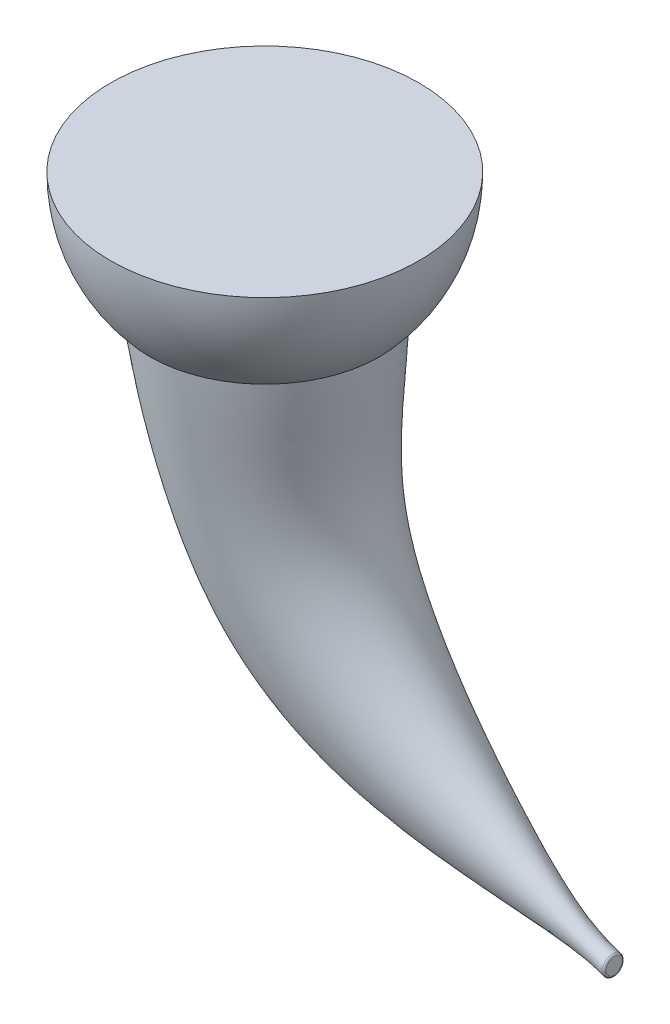
ISO-10303-21;
HEADER;
FILE_DESCRIPTION(('STEP AP214'),'2;1');
FILE_NAME('part.step','',(''),(''),'','','');
FILE_SCHEMA(('AUTOMOTIVE_DESIGN { 1 0 10303 214 1 1 1 1 }'));
ENDSEC;
DATA;
#1=APPLICATION_CONTEXT('core data for automotive mechanical design processes');
#2=APPLICATION_PROTOCOL_DEFINITION('international standard','automotive_design',2000,#1);
#3=PRODUCT_CONTEXT('',#1,'mechanical');
#4=PRODUCT('Part','Part','',(#3));
#5=PRODUCT_RELATED_PRODUCT_CATEGORY('part','',(#4));
#6=PRODUCT_DEFINITION_FORMATION('','',#4);
#7=PRODUCT_DEFINITION_CONTEXT('part definition',#1,'design');
#8=PRODUCT_DEFINITION('design','',#6,#7);
#9=PRODUCT_DEFINITION_SHAPE('','',#8);
#10=(LENGTH_UNIT() NAMED_UNIT(*) SI_UNIT(.MILLI.,.METRE.));
#11=(NAMED_UNIT(*) PLANE_ANGLE_UNIT() SI_UNIT($,.RADIAN.));
#12=(NAMED_UNIT(*) SI_UNIT($,.STERADIAN.) SOLID_ANGLE_UNIT());
#13=UNCERTAINTY_MEASURE_WITH_UNIT(LENGTH_MEASURE(1.E-05),#10,'distance_accuracy_value','');
#14=(GEOMETRIC_REPRESENTATION_CONTEXT(3) GLOBAL_UNCERTAINTY_ASSIGNED_CONTEXT((#13)) GLOBAL_UNIT_ASSIGNED_CONTEXT((#10,
#11,#12)) REPRESENTATION_CONTEXT('',''));
#15=CARTESIAN_POINT('',(0.,0.,0.));
#16=DIRECTION('',(0.,0.,1.));
#17=DIRECTION('',(1.,0.,0.));
#18=AXIS2_PLACEMENT_3D('',#15,#16,#17);
#19=CARTESIAN_POINT('',(17.,-25.,0.));
#20=DIRECTION('',(-1.,0.,0.));
#21=DIRECTION('',(0.,0.,1.));
#22=AXIS2_PLACEMENT_3D('',#19,#20,#21);
#23=PLANE('',#22);
#24=CARTESIAN_POINT('',(17.,-25.3356408166107,0.122282258978879));
#25=CARTESIAN_POINT('',(17.,-25.4697729904689,0.167322496235213));
#26=CARTESIAN_POINT('',(16.8666221119389,-25.4250025036247,0.152289016261358));
#27=CARTESIAN_POINT('',(17.,-25.3321107105864,0.13279880806398));
#28=CARTESIAN_POINT('',(17.,-25.4647024969682,0.181508120353089));
#29=CARTESIAN_POINT('',(16.8668049699655,-25.4206870517036,0.165345043521263));
#30=CARTESIAN_POINT('',(17.,-25.3281366736652,0.143159465604385));
#31=CARTESIAN_POINT('',(17.,-25.4589900298676,0.19545455038704));
#32=CARTESIAN_POINT('',(16.8670174684006,-25.4158286119792,0.178213354682603));
#33=CARTESIAN_POINT('',(17.,-25.3193446290216,0.163516505921891));
#34=CARTESIAN_POINT('',(17.,-25.4464836853122,0.222635002906174));
#35=CARTESIAN_POINT('',(16.8674674932555,-25.4051191167752,0.203410457307485));
#36=CARTESIAN_POINT('',(17.,-25.3145266057802,0.173512881996638));
#37=CARTESIAN_POINT('',(17.,-25.4396956099888,0.235866574435541));
#38=CARTESIAN_POINT('',(16.8677050201355,-25.3992680430436,0.215739238845151));
#39=CARTESIAN_POINT('',(17.,-25.2988706797844,0.202858771474465));
#40=CARTESIAN_POINT('',(17.,-25.4175854368461,0.274579648905682));
#41=CARTESIAN_POINT('',(16.868533222332,-25.3802128542943,0.252046994042914));
#42=CARTESIAN_POINT('',(17.,-25.2868252910844,0.221581620130043));
#43=CARTESIAN_POINT('',(17.,-25.4004996861291,0.299188251594623));
#44=CARTESIAN_POINT('',(16.8692397088052,-25.3655000011405,0.275367640427366));
#45=CARTESIAN_POINT('',(17.,-25.2595335942021,0.257059365041849));
#46=CARTESIAN_POINT('',(17.,-25.3618327407779,0.345277999124935));
#47=CARTESIAN_POINT('',(16.8709463143362,-25.3320762598217,0.319701931761529));
#48=CARTESIAN_POINT('',(17.,-25.2442347712504,0.273773911076594));
#49=CARTESIAN_POINT('',(17.,-25.3402998487906,0.366656908153542));
#50=CARTESIAN_POINT('',(16.8719513737534,-25.313299676778,0.340667851281826));
#51=CARTESIAN_POINT('',(17.,-25.2110508457208,0.304347443948018));
#52=CARTESIAN_POINT('',(17.,-25.2938747267772,0.405011108570092));
#53=CARTESIAN_POINT('',(16.8742367584853,-25.2724779062474,0.379143763399635));
#54=CARTESIAN_POINT('',(17.,-25.1931660868497,0.318206809685112));
#55=CARTESIAN_POINT('',(17.,-25.2691123868465,0.421990423691124));
#56=CARTESIAN_POINT('',(16.8755170472291,-25.2504331531358,0.396654214546572));
#57=CARTESIAN_POINT('',(17.,-25.1367874613879,0.354589595850642));
#58=CARTESIAN_POINT('',(17.,-25.1924367570646,0.464899114605402));
#59=CARTESIAN_POINT('',(16.8796962835128,-25.1808059570031,0.442772001750696));
#60=CARTESIAN_POINT('',(17.,-25.0951095931608,0.37250397611175));
#61=CARTESIAN_POINT('',(17.,-25.1367931879768,0.484596402633514));
#62=CARTESIAN_POINT('',(16.8829619917275,-25.1291682571869,0.465701752987218));
#63=CARTESIAN_POINT('',(17.,-25.0300334068381,0.388357309817668));
#64=CARTESIAN_POINT('',(17.,-25.0505506496973,0.498824042553357));
#65=CARTESIAN_POINT('',(16.8885460133124,-25.0480532206865,0.486232112619357));
#66=CARTESIAN_POINT('',(17.,-25.0077918815382,0.391793949074053));
#67=CARTESIAN_POINT('',(17.,-25.0217374913723,0.501057576620627));
#68=CARTESIAN_POINT('',(16.8905337982318,-25.0202502738573,0.490751486980942));
#69=CARTESIAN_POINT('',(17.,-24.9630242074133,0.394830716283366));
#70=CARTESIAN_POINT('',(17.,-24.964351313639,0.500402262707482));
#71=CARTESIAN_POINT('',(16.8947268457448,-24.9641114737629,0.494868823599477));
#72=CARTESIAN_POINT('',(17.,-24.9404981709376,0.394432314079834));
#73=CARTESIAN_POINT('',(17.,-24.935817714864,0.49762911897101));
#74=CARTESIAN_POINT('',(16.8969320246979,-24.9357758288185,0.494468671330683));
#75=CARTESIAN_POINT('',(17.,-24.8962471892877,0.38975547168622));
#76=CARTESIAN_POINT('',(17.,-24.8804567384404,0.487233053040091));
#77=CARTESIAN_POINT('',(16.9014114728652,-24.8800482469581,0.488614987584741));
#78=CARTESIAN_POINT('',(17.,-24.8745151229341,0.385545288041291));
#79=CARTESIAN_POINT('',(17.,-24.8536007603101,0.479804947204921));
#80=CARTESIAN_POINT('',(16.903683848871,-24.8526484759303,0.483250317133353));
#81=CARTESIAN_POINT('',(17.,-24.8427166582274,0.376492739656416));
#82=CARTESIAN_POINT('',(17.,-24.8146665928344,0.4654022128681));
#83=CARTESIAN_POINT('',(16.9070388378222,-24.8126452040515,0.471653210960662));
#84=CARTESIAN_POINT('',(17.,-24.8322447796421,0.373016285337634));
#85=CARTESIAN_POINT('',(17.,-24.8019945240739,0.460106278827564));
#86=CARTESIAN_POINT('',(16.9081488473374,-24.7994864208703,0.467192316883826));
#87=CARTESIAN_POINT('',(17.,-24.8116319603346,0.365191275706193));
#88=CARTESIAN_POINT('',(17.,-24.7772737238806,0.448609115009445));
#89=CARTESIAN_POINT('',(16.9103002164359,-24.7736890196705,0.457189781614473));
#90=CARTESIAN_POINT('',(17.,-24.8014910558755,0.36084262520218));
#91=CARTESIAN_POINT('',(17.,-24.765209497933,0.442412210742255));
#92=CARTESIAN_POINT('',(16.9113415685094,-24.7610504586106,0.451648022458333));
#93=CARTESIAN_POINT('',(17.,-24.7719303022118,0.346645892745383));
#94=CARTESIAN_POINT('',(17.,-24.7303074587816,0.422577140854096));
#95=CARTESIAN_POINT('',(16.914439101884,-24.7241357450048,0.433483518898954));
#96=CARTESIAN_POINT('',(17.,-24.7530809069025,0.335563341447202));
#97=CARTESIAN_POINT('',(17.,-24.708059222266,0.407436594534156));
#98=CARTESIAN_POINT('',(16.9164970100325,-24.7004992512258,0.419216874938152));
#99=CARTESIAN_POINT('',(17.,-24.7176110893768,0.310329682907767));
#100=CARTESIAN_POINT('',(17.,-24.6666396821066,0.374026502344487));
#101=CARTESIAN_POINT('',(16.9202407122356,-24.6561790676793,0.38683613208621));
#102=CARTESIAN_POINT('',(17.,-24.7009894377288,0.296180279558163));
#103=CARTESIAN_POINT('',(17.,-24.647347231466,0.355749695696653));
#104=CARTESIAN_POINT('',(16.9219267118711,-24.6354937488282,0.368724169703593));
#105=CARTESIAN_POINT('',(17.,-24.6557712124933,0.250400587069459));
#106=CARTESIAN_POINT('',(17.,-24.5956659274118,0.29828608994971));
#107=CARTESIAN_POINT('',(16.9262760985114,-24.5794937607475,0.310548159493342));
#108=CARTESIAN_POINT('',(17.,-24.6308846954614,0.214974266022337));
#109=CARTESIAN_POINT('',(17.,-24.5672112153915,0.254912811397691));
#110=CARTESIAN_POINT('',(16.9283367202792,-24.5490569111965,0.266029961272501));
#111=CARTESIAN_POINT('',(17.,-24.5931076458735,0.137091255155098));
#112=CARTESIAN_POINT('',(17.,-24.5244933692924,0.161671714754807));
#113=CARTESIAN_POINT('',(16.9311551015198,-24.5029965441759,0.169089188014232));
#114=CARTESIAN_POINT('',(17.,-24.5805535884695,0.0944727113789788));
#115=CARTESIAN_POINT('',(17.,-24.5102221269509,0.111199389269075));
#116=CARTESIAN_POINT('',(16.9318767708865,-24.4877883175131,0.116487950102534));
#117=CARTESIAN_POINT('',(17.,-24.5722343552345,0.0285955482823736));
#118=CARTESIAN_POINT('',(17.,-24.5006827170371,0.0335671276270605));
#119=CARTESIAN_POINT('',(16.9322042088683,-24.4776435968825,0.0351604764341383));
#120=CARTESIAN_POINT('',(17.,-24.5713001153891,0.00587650779675672));
#121=CARTESIAN_POINT('',(17.,-24.4995617278362,0.00679764329900963));
#122=CARTESIAN_POINT('',(16.9321795924319,-24.4764772274513,0.00710965890458925));
#123=CARTESIAN_POINT('',(17.,-24.5732716377448,-0.0393992992874983));
#124=CARTESIAN_POINT('',(17.,-24.5016317464374,-0.0465709644748686));
#125=CARTESIAN_POINT('',(16.9318626845769,-24.4788032515095,-0.048842198983232));
#126=CARTESIAN_POINT('',(17.,-24.5761730790444,-0.0619562197507527));
#127=CARTESIAN_POINT('',(17.,-24.50482517415,-0.0732242649487849));
#128=CARTESIAN_POINT('',(16.931570694469,-24.4822904028414,-0.0767433723859995));
#129=CARTESIAN_POINT('',(17.,-24.5840989781865,-0.0986627945584033));
#130=CARTESIAN_POINT('',(17.,-24.5136280731717,-0.116659255049918));
#131=CARTESIAN_POINT('',(16.9308667800196,-24.4918725381808,-0.122197502978594));
#132=CARTESIAN_POINT('',(17.,-24.5880599506323,-0.113052716446738));
#133=CARTESIAN_POINT('',(17.,-24.518051695873,-0.133737542722164));
#134=CARTESIAN_POINT('',(16.9305298737476,-24.4966701431352,-0.140030260627986));
#135=CARTESIAN_POINT('',(17.,-24.5975396907884,-0.141312065070061));
#136=CARTESIAN_POINT('',(17.,-24.5286406292673,-0.167291632582864));
#137=CARTESIAN_POINT('',(16.9297490021491,-24.5081356261946,-0.174997797370048));
#138=CARTESIAN_POINT('',(17.,-24.6030587802432,-0.155181383631858));
#139=CARTESIAN_POINT('',(17.,-24.5348159770334,-0.183779542681219));
#140=CARTESIAN_POINT('',(16.9293050147135,-24.5148038905808,-0.192132431466115));
#141=CARTESIAN_POINT('',(17.,-24.6185738770665,-0.188690900168415));
#142=CARTESIAN_POINT('',(17.,-24.5522684006844,-0.223887205283506));
#143=CARTESIAN_POINT('',(16.9280515487512,-24.5336379234617,-0.233700821015042));
#144=CARTESIAN_POINT('',(17.,-24.6294502826954,-0.207934421531435));
#145=CARTESIAN_POINT('',(17.,-24.5645884217861,-0.24714592586387));
#146=CARTESIAN_POINT('',(16.9271687022988,-24.5469095022974,-0.257725254138611));
#147=CARTESIAN_POINT('',(17.,-24.6542717196406,-0.244316968150462));
#148=CARTESIAN_POINT('',(17.,-24.592823555195,-0.291598409273236));
#149=CARTESIAN_POINT('',(16.9250660233958,-24.5773651977954,-0.303375074475826));
#150=CARTESIAN_POINT('',(17.,-24.668218348621,-0.261454890446322));
#151=CARTESIAN_POINT('',(17.,-24.6088101654415,-0.31283564894115));
#152=CARTESIAN_POINT('',(16.9238460154104,-24.5945513516625,-0.324999203788676));
#153=CARTESIAN_POINT('',(17.,-24.7141466767414,-0.308893459958356));
#154=CARTESIAN_POINT('',(17.,-24.6619779565283,-0.372724777110787));
#155=CARTESIAN_POINT('',(16.9197298815172,-24.6513389293173,-0.385015924591131));
#156=CARTESIAN_POINT('',(17.,-24.7502783971983,-0.335351300729194));
#157=CARTESIAN_POINT('',(17.,-24.7043800958971,-0.407180842360841));
#158=CARTESIAN_POINT('',(16.9163728794422,-24.6962441492336,-0.418718886741355));
#159=CARTESIAN_POINT('',(17.,-24.8289815373202,-0.374598436477156));
#160=CARTESIAN_POINT('',(17.,-24.7978225438548,-0.461146836178574));
#161=CARTESIAN_POINT('',(16.9090404968911,-24.794453369255,-0.468743826037898));
#162=CARTESIAN_POINT('',(17.,-24.871505987163,-0.387482347388135));
#163=CARTESIAN_POINT('',(17.,-24.8494613533892,-0.480479723271562));
#164=CARTESIAN_POINT('',(16.9050696211939,-24.8476962196587,-0.485186114328076));
#165=CARTESIAN_POINT('',(17.,-24.936744531951,-0.395903883081402));
#166=CARTESIAN_POINT('',(17.,-24.9296678219946,-0.496662193562039));
#167=CARTESIAN_POINT('',(16.8991686091905,-24.9295561631734,-0.495822150488316));
#168=CARTESIAN_POINT('',(17.,-24.9588779272943,-0.396864250744802));
#169=CARTESIAN_POINT('',(17.,-24.9574778115752,-0.499851027502412));
#170=CARTESIAN_POINT('',(16.8971984956658,-24.9573584158455,-0.496991326730204));
#171=CARTESIAN_POINT('',(17.,-25.0030120702838,-0.39503742373095));
#172=CARTESIAN_POINT('',(17.,-25.013626458617,-0.501557837277415));
#173=CARTESIAN_POINT('',(16.8933664230364,-25.0127732210582,-0.494517598669394));
#174=CARTESIAN_POINT('',(17.,-25.0250128023286,-0.392249796598471));
#175=CARTESIAN_POINT('',(17.,-25.041960776247,-0.499978941534042));
#176=CARTESIAN_POINT('',(16.8915044764382,-25.0403857513385,-0.490874139070745));
#177=CARTESIAN_POINT('',(17.,-25.0681055115317,-0.383019028402749));
#178=CARTESIAN_POINT('',(17.,-25.0981009724478,-0.491997250762882));
#179=CARTESIAN_POINT('',(16.8879718528896,-25.094362920631,-0.478934396295298));
#180=CARTESIAN_POINT('',(17.,-25.0892019156309,-0.376596600913957));
#181=CARTESIAN_POINT('',(17.,-25.125864452833,-0.485530814768234));
#182=CARTESIAN_POINT('',(16.8863001560458,-25.120733721388,-0.470664480874051));
#183=CARTESIAN_POINT('',(17.,-25.1198243034484,-0.364446530485284));
#184=CARTESIAN_POINT('',(17.,-25.1662228995006,-0.472489705694745));
#185=CARTESIAN_POINT('',(16.8839803323524,-25.1587632692938,-0.45519633363435));
#186=CARTESIAN_POINT('',(17.,-25.1298658237301,-0.359974438747207));
#187=CARTESIAN_POINT('',(17.,-25.1795412992087,-0.467541110438537));
#188=CARTESIAN_POINT('',(16.8832380435375,-25.1711907615819,-0.449526391682238));
#189=CARTESIAN_POINT('',(17.,-25.1495471292446,-0.350220128080431));
#190=CARTESIAN_POINT('',(17.,-25.2059185806254,-0.456469023524208));
#191=CARTESIAN_POINT('',(16.8817797099444,-25.195624146631,-0.437125367287789));
#192=CARTESIAN_POINT('',(17.,-25.1591869202806,-0.344937920859544));
#193=CARTESIAN_POINT('',(17.,-25.2189724634216,-0.450336202042438));
#194=CARTESIAN_POINT('',(16.8810636647871,-25.2076300454817,-0.430394300180825));
#195=CARTESIAN_POINT('',(17.,-25.1876470890645,-0.327722235721094));
#196=CARTESIAN_POINT('',(17.,-25.257949279396,-0.429910496900015));
#197=CARTESIAN_POINT('',(16.8789507511417,-25.2430672833188,-0.408465927819508));
#198=CARTESIAN_POINT('',(17.,-25.2057300429862,-0.314528614547533));
#199=CARTESIAN_POINT('',(17.,-25.2829174808517,-0.413840201488044));
#200=CARTESIAN_POINT('',(16.8776098005377,-25.2655714250674,-0.391672500396162));
#201=CARTESIAN_POINT('',(17.,-25.239306087731,-0.285231940402884));
#202=CARTESIAN_POINT('',(17.,-25.3298349011895,-0.377339668378698));
#203=CARTESIAN_POINT('',(16.875126098613,-25.3072548539831,-0.354497694776287));
#204=CARTESIAN_POINT('',(17.,-25.2548000470401,-0.269129866868184));
#205=CARTESIAN_POINT('',(17.,-25.3516833981736,-0.356879287319027));
#206=CARTESIAN_POINT('',(16.8739832808233,-25.3264352561891,-0.33411752449308));
#207=CARTESIAN_POINT('',(17.,-25.2958984093582,-0.218205912932596));
#208=CARTESIAN_POINT('',(17.,-25.4105853869264,-0.290868574819163));
#209=CARTESIAN_POINT('',(16.8709409022239,-25.3771065775477,-0.269981742926947));
#210=CARTESIAN_POINT('',(17.,-25.3174164810731,-0.17995446094423));
#211=CARTESIAN_POINT('',(17.,-25.4414189536892,-0.240631265944746));
#212=CARTESIAN_POINT('',(16.8693324560289,-25.4033468493564,-0.222182566693656));
#213=CARTESIAN_POINT('',(17.,-25.3472657982975,-0.0978093254314152));
#214=CARTESIAN_POINT('',(17.,-25.4852407606026,-0.130903484732841));
#215=CARTESIAN_POINT('',(16.8669477005696,-25.439585802428,-0.120130880840412));
#216=CARTESIAN_POINT('',(17.,-25.3553411910705,-0.0538229869313334));
#217=CARTESIAN_POINT('',(17.,-25.4972596109713,-0.0718250108398934));
#218=CARTESIAN_POINT('',(16.8661876253379,-25.4492694549901,-0.0657738312602855));
#219=CARTESIAN_POINT('',(17.,-25.3564575246691,0.0125405539565123));
#220=CARTESIAN_POINT('',(17.,-25.4994128896306,0.0182621429726876));
#221=CARTESIAN_POINT('',(16.865778483532,-25.4504934650714,0.0162928174581873));
#222=CARTESIAN_POINT('',(17.,-25.3549263529602,0.0349453914634985));
#223=CARTESIAN_POINT('',(17.,-25.4973570392948,0.0487139920407503));
#224=CARTESIAN_POINT('',(16.8657675215188,-25.4485988801544,0.044008884352947));
#225=CARTESIAN_POINT('',(17.,-25.3480797122561,0.0792058405355065));
#226=CARTESIAN_POINT('',(17.,-25.4876596994949,0.108930955179652));
#227=CARTESIAN_POINT('',(16.8660048388089,-25.4402074897351,0.0988344367549028));
#228=CARTESIAN_POINT('',(17.,-25.3427640467222,0.101061423515279));
#229=CARTESIAN_POINT('',(17.,-25.4800469779742,0.138579154995805));
#230=CARTESIAN_POINT('',(16.8662531315762,-25.4337104452153,0.125943890683688));
#231=CARTESIAN_POINT('',(17.,-25.3356408166107,0.122282258978879));
#232=CARTESIAN_POINT('',(17.,-25.4697729904689,0.167322496235213));
#233=CARTESIAN_POINT('',(16.8666221119389,-25.4250025036247,0.152289016261358));
#234=(BOUNDED_SURFACE() B_SPLINE_SURFACE(3,2,((#24,#25,#26),(#27,#28,#29),(#30,#31,#32),(#33,
#34,#35),(#36,#37,#38),(#39,#40,#41),(#42,#43,#44),(#45,#46,#47),(#48,#49,#50),(#51,#52,#53),
(#54,#55,#56),(#57,#58,#59),(#60,#61,#62),(#63,#64,#65),(#66,#67,#68),(#69,#70,#71),(#72,#73,
#74),(#75,#76,#77),(#78,#79,#80),(#81,#82,#83),(#84,#85,#86),(#87,#88,#89),(#90,#91,#92),(#93,
#94,#95),(#96,#97,#98),(#99,#100,#101),(#102,#103,#104),(#105,#106,#107),(#108,#109,#110),(#111,
#112,#113),(#114,#115,#116),(#117,#118,#119),(#120,#121,#122),(#123,#124,#125),(#126,#127,#128),
(#129,#130,#131),(#132,#133,#134),(#135,#136,#137),(#138,#139,#140),(#141,#142,#143),(#144,#145,
#146),(#147,#148,#149),(#150,#151,#152),(#153,#154,#155),(#156,#157,#158),(#159,#160,#161),
(#162,#163,#164),(#165,#166,#167),(#168,#169,#170),(#171,#172,#173),(#174,#175,#176),(#177,#178,
#179),(#180,#181,#182),(#183,#184,#185),(#186,#187,#188),(#189,#190,#191),(#192,#193,#194),
(#195,#196,#197),(#198,#199,#200),(#201,#202,#203),(#204,#205,#206),(#207,#208,#209),(#210,#211,
#212),(#213,#214,#215),(#216,#217,#218),(#219,#220,#221),(#222,#223,#224),(#225,#226,#227),
(#228,#229,#230),(#231,#232,#233)),.UNSPECIFIED.,.T.,.F.,.F.) B_SPLINE_SURFACE_WITH_KNOTS((4,2,
2,2,2,2,2,2,2,2,2,2,2,2,2,2,2,2,2,2,2,2,2,2,2,2,2,2,2,2,2,2,2,2,4),(3,3),(0.,0.0332575604123347,
0.0665157324162518,0.13298019202367,0.200612266715542,0.268235360415139,0.401352162305116,
0.468616423498455,0.535854905569663,0.601912675935396,0.634978766946504,0.668048468751283,
0.733289229014274,0.798493835090958,0.925925104128339,1.05674387565176,1.12469064654031,
1.19256094046045,1.23725183199459,1.28195195876207,1.34793632299314,1.41395510527295,
1.54557656675133,1.67627437622517,1.74246922205142,1.80867170629913,1.87450066843399,
1.90744577642885,1.94039040834494,2.00716458288537,2.07391631265868,2.20306105121793,
2.33463680242306,2.4017421389119,2.46885096060995),(0.,1.),
.UNSPECIFIED.) GEOMETRIC_REPRESENTATION_ITEM() RATIONAL_B_SPLINE_SURFACE(((1.,0.577157309314127,
1.),(1.,0.577949224529891,1.),(1.,0.578867965708101,1.),(1.,0.580808548052177,1.),(1.,
0.581830391113694,1.),(1.,0.585381509929811,1.),(1.,0.588397209411046,1.),(1.,0.595604579601681,
1.),(1.,0.599815978500449,1.),(1.,0.609266864984566,1.),(1.,0.614506215973792,1.),(1.,
0.631351979661977,1.),(1.,0.644210379512988,1.),(1.,0.665418271155843,1.),(1.,0.672851529180123,
1.),(1.,0.688253331010856,1.),(1.,0.696221668576475,1.),(1.,0.712123104809014,1.),(1.,
0.720054365191013,1.),(1.,0.731579759901674,1.),(1.,0.735361663975748,1.),(1.,0.742640581586167,
1.),(1.,0.74613756396757,1.),(1.,0.756465342357467,1.),(1.,0.763229849057768,1.),(1.,
0.775398507694245,1.),(1.,0.780803411414885,1.),(1.,0.794649246945422,1.),(1.,0.801065063798609,
1.),(1.,0.809809875739834,1.),(1.,0.812025697172242,1.),(1.,0.813031619676622,1.),(1.,
0.812956324528348,1.),(1.,0.811981449518719,1.),(1.,0.811082797520106,1.),(1.,0.808909493710978,
1.),(1.,0.80786807340303,1.),(1.,0.805448001940625,1.),(1.,0.804069281142938,1.),(1.,
0.80016459911248,1.),(1.,0.797404962311162,1.),(1.,0.790784968629018,1.),(1.,0.786924038353347,
1.),(1.,0.773773844974525,1.),(1.,0.762902877052981,1.),(1.,0.73847444302014,1.),(1.,
0.724936364719492,1.),(1.,0.704197512137542,1.),(1.,0.697166565590311,1.),(1.,0.683285964157835,
1.),(1.,0.676436330285997,1.),(1.,0.663251429938828,1.),(1.,0.6569134793905,1.),(1.,
0.648005281227929,1.),(1.,0.645134475347812,1.),(1.,0.639457885996645,1.),(1.,0.636652101586579,
1.),(1.,0.628319107731566,1.),(1.,0.622955912835725,1.),(1.,0.612907749284322,1.),(1.,
0.608222553262889,1.),(1.,0.595628845647884,1.),(1.,0.58880080235283,1.),(1.,0.578590147848599,
1.),(1.,0.575274812695336,1.),(1.,0.573491038076502,1.),(1.,0.57344365238074,1.),(1.,
0.574477774989074,1.),(1.,0.575559341923983,1.),(1.,0.577157309314127,1.))) REPRESENTATION_ITEM('') SURFACE());
#235=CARTESIAN_POINT('',(17.,-25.3356408166107,0.122282258978879));
#236=CARTESIAN_POINT('',(17.,-25.3321107105864,0.13279880806398));
#237=CARTESIAN_POINT('',(17.,-25.3281366736652,0.143159465604385));
#238=CARTESIAN_POINT('',(17.,-25.3193446290216,0.163516505921891));
#239=CARTESIAN_POINT('',(17.,-25.3145266057802,0.173512881996638));
#240=CARTESIAN_POINT('',(17.,-25.2988706797844,0.202858771474465));
#241=CARTESIAN_POINT('',(17.,-25.2868252910844,0.221581620130043));
#242=CARTESIAN_POINT('',(17.,-25.2595335942021,0.257059365041849));
#243=CARTESIAN_POINT('',(17.,-25.2442347712504,0.273773911076594));
#244=CARTESIAN_POINT('',(17.,-25.2110508457208,0.304347443948018));
#245=CARTESIAN_POINT('',(17.,-25.1931660868497,0.318206809685112));
#246=CARTESIAN_POINT('',(17.,-25.1367874613879,0.354589595850642));
#247=CARTESIAN_POINT('',(17.,-25.0951095931608,0.37250397611175));
#248=CARTESIAN_POINT('',(17.,-25.0300334068381,0.388357309817668));
#249=CARTESIAN_POINT('',(17.,-25.0077918815382,0.391793949074053));
#250=CARTESIAN_POINT('',(17.,-24.9630242074133,0.394830716283366));
#251=CARTESIAN_POINT('',(17.,-24.9404981709376,0.394432314079834));
#252=CARTESIAN_POINT('',(17.,-24.8962471892877,0.38975547168622));
#253=CARTESIAN_POINT('',(17.,-24.8745151229342,0.385545288041291));
#254=CARTESIAN_POINT('',(17.,-24.8427166582274,0.376492739656416));
#255=CARTESIAN_POINT('',(17.,-24.8322447796421,0.373016285337634));
#256=CARTESIAN_POINT('',(17.,-24.8116319603346,0.365191275706193));
#257=CARTESIAN_POINT('',(17.,-24.8014910558755,0.36084262520218));
#258=CARTESIAN_POINT('',(17.,-24.7719303022118,0.346645892745383));
#259=CARTESIAN_POINT('',(17.,-24.7530809069025,0.335563341447202));
#260=CARTESIAN_POINT('',(17.,-24.7176110893768,0.310329682907767));
#261=CARTESIAN_POINT('',(17.,-24.7009894377288,0.296180279558163));
#262=CARTESIAN_POINT('',(17.,-24.6557712124933,0.250400587069459));
#263=CARTESIAN_POINT('',(17.,-24.6308846954614,0.214974266022337));
#264=CARTESIAN_POINT('',(17.,-24.5931076458735,0.137091255155098));
#265=CARTESIAN_POINT('',(17.,-24.5805535884695,0.0944727113789787));
#266=CARTESIAN_POINT('',(17.,-24.5722343552345,0.0285955482823737));
#267=CARTESIAN_POINT('',(17.,-24.5713001153891,0.00587650779675672));
#268=CARTESIAN_POINT('',(17.,-24.5732716377448,-0.0393992992874982));
#269=CARTESIAN_POINT('',(17.,-24.5761730790444,-0.0619562197507527));
#270=CARTESIAN_POINT('',(17.,-24.5840989781865,-0.0986627945584033));
#271=CARTESIAN_POINT('',(17.,-24.5880599506323,-0.113052716446738));
#272=CARTESIAN_POINT('',(17.,-24.5975396907884,-0.141312065070061));
#273=CARTESIAN_POINT('',(17.,-24.6030587802432,-0.155181383631858));
#274=CARTESIAN_POINT('',(17.,-24.6185738770665,-0.188690900168415));
#275=CARTESIAN_POINT('',(17.,-24.6294502826954,-0.207934421531435));
#276=CARTESIAN_POINT('',(17.,-24.6542717196406,-0.244316968150462));
#277=CARTESIAN_POINT('',(17.,-24.668218348621,-0.261454890446321));
#278=CARTESIAN_POINT('',(17.,-24.7141466767414,-0.308893459958356));
#279=CARTESIAN_POINT('',(17.,-24.7502783971983,-0.335351300729194));
#280=CARTESIAN_POINT('',(17.,-24.8289815373202,-0.374598436477156));
#281=CARTESIAN_POINT('',(17.,-24.871505987163,-0.387482347388135));
#282=CARTESIAN_POINT('',(17.,-24.936744531951,-0.395903883081402));
#283=CARTESIAN_POINT('',(17.,-24.9588779272943,-0.396864250744802));
#284=CARTESIAN_POINT('',(17.,-25.0030120702838,-0.39503742373095));
#285=CARTESIAN_POINT('',(17.,-25.0250128023286,-0.392249796598471));
#286=CARTESIAN_POINT('',(17.,-25.0681055115317,-0.383019028402749));
#287=CARTESIAN_POINT('',(17.,-25.0892019156309,-0.376596600913957));
#288=CARTESIAN_POINT('',(17.,-25.1198243034484,-0.364446530485284));
#289=CARTESIAN_POINT('',(17.,-25.1298658237301,-0.359974438747207));
#290=CARTESIAN_POINT('',(17.,-25.1495471292446,-0.350220128080431));
#291=CARTESIAN_POINT('',(17.,-25.1591869202806,-0.344937920859544));
#292=CARTESIAN_POINT('',(17.,-25.1876470890645,-0.327722235721094));
#293=CARTESIAN_POINT('',(17.,-25.2057300429862,-0.314528614547533));
#294=CARTESIAN_POINT('',(17.,-25.239306087731,-0.285231940402884));
#295=CARTESIAN_POINT('',(17.,-25.2548000470401,-0.269129866868184));
#296=CARTESIAN_POINT('',(17.,-25.2958984093582,-0.218205912932596));
#297=CARTESIAN_POINT('',(17.,-25.3174164810731,-0.17995446094423));
#298=CARTESIAN_POINT('',(17.,-25.3472657982974,-0.097809325431415));
#299=CARTESIAN_POINT('',(17.,-25.3553411910705,-0.0538229869313332));
#300=CARTESIAN_POINT('',(17.,-25.3564575246691,0.0125405539565123));
#301=CARTESIAN_POINT('',(17.,-25.3549263529602,0.0349453914634984));
#302=CARTESIAN_POINT('',(17.,-25.3480797122561,0.0792058405355064));
#303=CARTESIAN_POINT('',(17.,-25.3427640467222,0.101061423515279));
#304=CARTESIAN_POINT('',(17.,-25.3356408166107,0.122282258978879));
#305=B_SPLINE_CURVE_WITH_KNOTS('',3,(#235,#236,#237,#238,#239,#240,#241,#242,#243,#244,#245,
#246,#247,#248,#249,#250,#251,#252,#253,#254,#255,#256,#257,#258,#259,#260,#261,#262,#263,#264,
#265,#266,#267,#268,#269,#270,#271,#272,#273,#274,#275,#276,#277,#278,#279,#280,#281,#282,#283,
#284,#285,#286,#287,#288,#289,#290,#291,#292,#293,#294,#295,#296,#297,#298,#299,#300,#301,#302,
#303,#304),.UNSPECIFIED.,.T.,.F.,(4,2,2,2,2,2,2,2,2,2,2,2,2,2,2,2,2,2,2,2,2,2,2,2,2,2,2,2,2,2,2,
2,2,2,4),(0.,0.0332575604123347,0.0665157324162518,0.13298019202367,0.200612266715542,
0.268235360415139,0.401352162305116,0.468616423498455,0.535854905569663,0.601912675935396,
0.634978766946504,0.668048468751283,0.733289229014274,0.798493835090958,0.925925104128339,
1.05674387565176,1.12469064654031,1.19256094046045,1.23725183199459,1.28195195876207,
1.34793632299314,1.41395510527295,1.54557656675133,1.67627437622517,1.74246922205142,
1.80867170629913,1.87450066843399,1.90744577642885,1.94039040834494,2.00716458288537,
2.07391631265868,2.20306105121793,2.33463680242306,2.4017421389119,2.46885096060995),.UNSPECIFIED.);
#306=CARTESIAN_POINT('',(17.,-25.3356408166107,0.122282258978879));
#307=VERTEX_POINT('',#306);
#308=EDGE_CURVE('E12',#307,#307,#305,.T.);
#309=ORIENTED_EDGE('',*,*,#308,.F.);
#310=EDGE_LOOP('',(#309));
#311=FACE_BOUND('',#310,.T.);
#312=ADVANCED_FACE('F48',(#311),#23,.F.);
#313=CARTESIAN_POINT('',(0.,-3.,0.));
#314=DIRECTION('',(0.,-1.,0.));
#315=DIRECTION('',(0.,0.,1.));
#316=AXIS2_PLACEMENT_3D('',#313,#314,#315);
#317=PLANE('',#316);
#318=CARTESIAN_POINT('',(0.,-3.,5.));
#319=CARTESIAN_POINT('',(-0.137978752480775,-3.,5.));
#320=CARTESIAN_POINT('',(-0.411340506946171,-3.,4.98879787524808));
#321=CARTESIAN_POINT('',(-0.812304931017433,-3.,4.93967927000279));
#322=CARTESIAN_POINT('',(-1.2029001913235,-3.,4.85953620277847));
#323=CARTESIAN_POINT('',(-3.47651103373854,-3.,4.20027676438849));
#324=CARTESIAN_POINT('',(-5.,-3.,2.2076600396924));
#325=CARTESIAN_POINT('',(-5.,-3.,-2.7595750496155));
#326=CARTESIAN_POINT('',(-2.7595750496155,-3.,-5.));
#327=CARTESIAN_POINT('',(2.7595750496155,-3.,-5.));
#328=CARTESIAN_POINT('',(5.,-3.,-2.7595750496155));
#329=CARTESIAN_POINT('',(5.,-3.,2.2076600396924));
#330=CARTESIAN_POINT('',(3.47651103373854,-3.,4.20027676438849));
#331=CARTESIAN_POINT('',(1.2029001913235,-3.,4.85953620277847));
#332=CARTESIAN_POINT('',(0.812304931017432,-3.,4.93967927000279));
#333=CARTESIAN_POINT('',(0.411340506946168,-3.,4.98879787524808));
#334=CARTESIAN_POINT('',(0.137978752480774,-3.,5.));
#335=CARTESIAN_POINT('',(0.,-3.,5.));
#336=B_SPLINE_CURVE_WITH_KNOTS('',3,(#318,#319,#320,#321,#322,#323,#324,#325,#326,#327,#328,
#329,#330,#331,#332,#333,#334,#335),.UNSPECIFIED.,.T.,.F.,(4,1,1,1,1,2,2,2,1,1,1,1,4),(0.,
0.0125,0.025,0.0375,0.05,0.25,0.5,0.75,0.95,0.9625,0.975,0.9875,1.),.UNSPECIFIED.);
#337=CARTESIAN_POINT('',(0.,-3.,5.));
#338=VERTEX_POINT('',#337);
#339=EDGE_CURVE('E63',#338,#338,#336,.F.);
#340=ORIENTED_EDGE('',*,*,#339,.T.);
#341=EDGE_LOOP('',(#340));
#342=FACE_BOUND('',#341,.T.);
#343=ADVANCED_FACE('F91',(#342),#317,.F.);
#344=CARTESIAN_POINT('',(0.,-3.,5.));
#345=CARTESIAN_POINT('',(-0.151717198740971,-3.7127454449014,5.0746848263867));
#346=CARTESIAN_POINT('',(0.277333703234142,-7.6791774832582,4.88330043680216));
#347=CARTESIAN_POINT('',(2.53231519541065,-17.6045567764249,3.21364404679352));
#348=CARTESIAN_POINT('',(11.2796146298537,-22.6281778704337,1.42265982780458));
#349=CARTESIAN_POINT('',(17.,-25.4589071972745,0.198504872206427));
#350=CARTESIAN_POINT('',(0.137978752480774,-3.,5.));
#351=CARTESIAN_POINT('',(-0.0116349266092756,-3.71212511865426,5.07657170885396));
#352=CARTESIAN_POINT('',(0.413263949540047,-7.68480180692489,4.88051291727128));
#353=CARTESIAN_POINT('',(2.5862570313931,-17.492627012296,3.16413219609375));
#354=CARTESIAN_POINT('',(11.3095402962546,-22.5942563551639,1.41035522088953));
#355=CARTESIAN_POINT('',(17.,-25.4534293063488,0.211168760723303));
#356=CARTESIAN_POINT('',(0.411340506946168,-3.,4.98879787524808));
#357=CARTESIAN_POINT('',(0.26611954621008,-3.71084731405637,5.06903734731653));
#358=CARTESIAN_POINT('',(0.682132297748415,-7.69597033969511,4.86380139118647));
#359=CARTESIAN_POINT('',(2.68999745263865,-17.2734187152015,3.05916491370794));
#360=CARTESIAN_POINT('',(11.3680652970951,-22.5269345438099,1.38230195219067));
#361=CARTESIAN_POINT('',(17.,-25.4415484311869,0.235813560771588));
#362=CARTESIAN_POINT('',(0.812304931017432,-3.,4.93967927000279));
#363=CARTESIAN_POINT('',(0.674053481251242,-3.70887288917651,5.02494096113719));
#364=CARTESIAN_POINT('',(1.07554519137288,-7.71234094202934,4.80704050554041));
#365=CARTESIAN_POINT('',(2.83333905867174,-16.9588509255279,2.88433271085485));
#366=CARTESIAN_POINT('',(11.4496183626124,-22.429846442331,1.33227893993219));
#367=CARTESIAN_POINT('',(17.,-25.4211215765415,0.270664596291616));
#368=CARTESIAN_POINT('',(1.2029001913235,-3.,4.85953620277847));
#369=CARTESIAN_POINT('',(1.07202655906963,-3.70683557011421,4.94932041717497));
#370=CARTESIAN_POINT('',(1.45766856402164,-7.72831003087839,4.71992357638074));
#371=CARTESIAN_POINT('',(2.96423451993557,-16.6593978947892,2.69348860943495));
#372=CARTESIAN_POINT('',(11.5253975793274,-22.3364383612629,1.27435720406299));
#373=CARTESIAN_POINT('',(17.,-25.398258918023,0.303332233663247));
#374=CARTESIAN_POINT('',(3.47651103373854,-3.,4.20027676438849));
#375=CARTESIAN_POINT('',(3.39177848630467,-3.69437486761076,4.31446497736748));
#376=CARTESIAN_POINT('',(3.67609857115006,-7.82119835972795,4.02218235167811));
#377=CARTESIAN_POINT('',(3.67351565861672,-14.9581064723382,1.46002559897881));
#378=CARTESIAN_POINT('',(11.9441052269057,-21.7997897635424,0.884501445349408));
#379=CARTESIAN_POINT('',(17.,-25.2474865718492,0.485834267426657));
#380=CARTESIAN_POINT('',(5.,-3.,2.2076600396924));
#381=CARTESIAN_POINT('',(4.98178216664722,-3.67939436110215,2.30552217535314));
#382=CARTESIAN_POINT('',(5.09053370489466,-7.88765876745404,2.06381524450443));
#383=CARTESIAN_POINT('',(3.74551103246843,-14.1440014262,-0.380081066718846));
#384=CARTESIAN_POINT('',(12.0417296319868,-21.521996960233,0.174660937385171));
#385=CARTESIAN_POINT('',(17.,-25.0041173440636,0.546553452085344));
#386=CARTESIAN_POINT('',(5.,-3.,-2.7595750496155));
#387=CARTESIAN_POINT('',(5.02556683496018,-3.66492289166483,-2.73685002537777));
#388=CARTESIAN_POINT('',(5.03705348142684,-7.88258820531721,-2.78359039340031));
#389=CARTESIAN_POINT('',(2.29150244576202,-15.2440134753004,-3.61613056069134));
#390=CARTESIAN_POINT('',(11.5416793973412,-21.6271977340694,-1.08644605121882));
#391=CARTESIAN_POINT('',(17.,-24.5482173574561,0.349349378760873));
#392=CARTESIAN_POINT('',(2.7595750496155,-3.,-5.));
#393=CARTESIAN_POINT('',(2.74205696396527,-3.66886371149848,-5.0471874278083));
#394=CARTESIAN_POINT('',(2.87727723058105,-7.78835427548671,-4.91239846016052));
#395=CARTESIAN_POINT('',(0.718713136254972,-17.5482714275622,-4.24900962652421));
#396=CARTESIAN_POINT('',(10.7730513024443,-22.2625142165623,-1.57772515738488));
#397=CARTESIAN_POINT('',(17.,-24.4315349842119,0.0547728981310897));
#398=CARTESIAN_POINT('',(-2.7595750496155,-3.,-5.));
#399=CARTESIAN_POINT('',(-2.86700036783469,-3.69215939002495,-5.09613777404829));
#400=CARTESIAN_POINT('',(-2.54433479090694,-7.56581904183992,-4.86930937738278));
#401=CARTESIAN_POINT('',(-1.48042534153315,-22.0599382123663,-2.16866001392492));
#402=CARTESIAN_POINT('',(9.68602241093383,-23.4822381927503,-1.25904719464199));
#403=CARTESIAN_POINT('',(17.,-24.6506506212391,-0.451782642543952));
#404=CARTESIAN_POINT('',(-5.,-3.,-2.7595750496155));
#405=CARTESIAN_POINT('',(-5.15424763017775,-3.71151424871778,-2.83475071785777));
#406=CARTESIAN_POINT('',(-4.74575882170357,-7.47025610929071,-2.68081395967629));
#407=CARTESIAN_POINT('',(-1.67062253992781,-23.3758057487606,0.0925595710781776));
#408=CARTESIAN_POINT('',(9.36762161432022,-24.0254241568039,-0.353793438931891));
#409=CARTESIAN_POINT('',(17.,-24.9452271018689,-0.568465015788067));
#410=CARTESIAN_POINT('',(-5.,-3.,2.2076600396924));
#411=CARTESIAN_POINT('',(-5.19234872354965,-3.72632073180949,2.19153715100272));
#412=CARTESIAN_POINT('',(-4.70700529388011,-7.47512004222273,2.2079441318566));
#413=CARTESIAN_POINT('',(-0.193363397047375,-22.2591520911094,3.27162353482284));
#414=CARTESIAN_POINT('',(9.82372486804214,-23.983542900576,0.99943428576653));
#415=CARTESIAN_POINT('',(17.,-25.4011270884765,-0.371260942463595));
#416=CARTESIAN_POINT('',(-3.47651103373854,-3.,4.20027676438849));
#417=CARTESIAN_POINT('',(-3.66940651452249,-3.72574493852632,4.22009450637041));
#418=CARTESIAN_POINT('',(-3.16834192740555,-7.53754586609074,4.16087342597074));
#419=CARTESIAN_POINT('',(0.953235027221987,-20.5974264376931,3.95602094679111));
#420=CARTESIAN_POINT('',(10.427925175403,-23.513775630201,1.50607465772109));
#421=CARTESIAN_POINT('',(17.,-25.5235283232398,-0.152324106488032));
#422=CARTESIAN_POINT('',(-1.2029001913235,-3.,4.85953620277847));
#423=CARTESIAN_POINT('',(-1.37085469633107,-3.71771000273327,4.91641654137724));
#424=CARTESIAN_POINT('',(-0.911428746444921,-7.63012167300846,4.76855431671848));
#425=CARTESIAN_POINT('',(2.02371711615889,-18.6104618189107,3.55630571203751));
#426=CARTESIAN_POINT('',(11.0006407004286,-22.9303143642242,1.49059968100177));
#427=CARTESIAN_POINT('',(17.,-25.4937715375253,0.082524411502771));
#428=CARTESIAN_POINT('',(-0.812304931017433,-3.,4.93967927000279));
#429=CARTESIAN_POINT('',(-0.975503099843774,-3.71621443911469,5.0026425540017));
#430=CARTESIAN_POINT('',(-0.524513562751412,-7.64604079544614,4.84008104756262));
#431=CARTESIAN_POINT('',(2.19837226480766,-18.2763586156461,3.46675373020387));
#432=CARTESIAN_POINT('',(11.0953696449365,-22.8309579341031,1.47857513374937));
#433=CARTESIAN_POINT('',(17.,-25.4856201711512,0.12155556460144));
#434=CARTESIAN_POINT('',(-0.411340506946171,-3.,4.98879787524808));
#435=CARTESIAN_POINT('',(-0.569182585587783,-3.71456927153925,5.05771605251299));
#436=CARTESIAN_POINT('',(-0.128147121387788,-7.66238808955135,4.88060949971256));
#437=CARTESIAN_POINT('',(2.36852719659334,-17.9405395934939,3.35397597243942));
#438=CARTESIAN_POINT('',(11.1885112986898,-22.7302575277806,1.45660607711498));
#439=CARTESIAN_POINT('',(17.,-25.4742096690927,0.160306713104338));
#440=CARTESIAN_POINT('',(-0.137978752480775,-3.,5.));
#441=CARTESIAN_POINT('',(-0.291799470872666,-3.71336577114855,5.07279794391944));
#442=CARTESIAN_POINT('',(0.141403456928237,-7.67355315959152,4.88608795633304));
#443=CARTESIAN_POINT('',(2.47837335942819,-17.7164865405537,3.26315589749329));
#444=CARTESIAN_POINT('',(11.2496889634528,-22.6620993857036,1.43496443471963));
#445=CARTESIAN_POINT('',(17.,-25.4643850882002,0.185840983689551));
#446=CARTESIAN_POINT('',(0.,-3.,5.));
#447=CARTESIAN_POINT('',(-0.151717198740971,-3.7127454449014,5.0746848263867));
#448=CARTESIAN_POINT('',(0.277333703234142,-7.6791774832582,4.88330043680216));
#449=CARTESIAN_POINT('',(2.53231519541065,-17.6045567764249,3.21364404679352));
#450=CARTESIAN_POINT('',(11.2796146298537,-22.6281778704337,1.42265982780458));
#451=CARTESIAN_POINT('',(17.,-25.4589071972745,0.198504872206427));
#452=B_SPLINE_SURFACE_WITH_KNOTS('',3,3,((#344,#345,#346,#347,#348,#349),(#350,#351,#352,#353,
#354,#355),(#356,#357,#358,#359,#360,#361),(#362,#363,#364,#365,#366,#367),(#368,#369,#370,#371,
#372,#373),(#374,#375,#376,#377,#378,#379),(#380,#381,#382,#383,#384,#385),(#386,#387,#388,#389,
#390,#391),(#392,#393,#394,#395,#396,#397),(#398,#399,#400,#401,#402,#403),(#404,#405,#406,#407,
#408,#409),(#410,#411,#412,#413,#414,#415),(#416,#417,#418,#419,#420,#421),(#422,#423,#424,#425,
#426,#427),(#428,#429,#430,#431,#432,#433),(#434,#435,#436,#437,#438,#439),(#440,#441,#442,#443,
#444,#445),(#446,#447,#448,#449,#450,#451)),.UNSPECIFIED.,.T.,.F.,.F.,(4,1,1,1,1,2,2,2,1,1,1,1,
4),(4,1,1,4),(0.,0.0125,0.0249999999999999,0.0375000000000001,0.05,0.25,0.5,0.75,0.95,0.9625,
0.975,0.9875,1.),(0.,0.065095157844899,0.401292651247166,1.),.UNSPECIFIED.);
#453=CARTESIAN_POINT('',(16.8666221119389,-25.4250025036247,0.152289016261358));
#454=CARTESIAN_POINT('',(16.8662531315762,-25.4337104452153,0.125943890683688));
#455=CARTESIAN_POINT('',(16.8660048388089,-25.4402074897351,0.0988344367549027));
#456=CARTESIAN_POINT('',(16.8657675215188,-25.4485988801544,0.0440088843529469));
#457=CARTESIAN_POINT('',(16.865778483532,-25.4504934650714,0.0162928174581873));
#458=CARTESIAN_POINT('',(16.8661876253379,-25.4492694549901,-0.0657738312602853));
#459=CARTESIAN_POINT('',(16.8669477005696,-25.439585802428,-0.120130880840411));
#460=CARTESIAN_POINT('',(16.8693324560289,-25.4033468493564,-0.222182566693656));
#461=CARTESIAN_POINT('',(16.8709409022239,-25.3771065775477,-0.269981742926947));
#462=CARTESIAN_POINT('',(16.8739832808233,-25.3264352561891,-0.33411752449308));
#463=CARTESIAN_POINT('',(16.875126098613,-25.3072548539831,-0.354497694776287));
#464=CARTESIAN_POINT('',(16.8776098005377,-25.2655714250674,-0.391672500396161));
#465=CARTESIAN_POINT('',(16.8789507511417,-25.2430672833188,-0.408465927819508));
#466=CARTESIAN_POINT('',(16.8810636647871,-25.2076300454818,-0.430394300180825));
#467=CARTESIAN_POINT('',(16.8817797099444,-25.195624146631,-0.437125367287789));
#468=CARTESIAN_POINT('',(16.8832380435375,-25.1711907615819,-0.449526391682238));
#469=CARTESIAN_POINT('',(16.8839803323524,-25.1587632692938,-0.45519633363435));
#470=CARTESIAN_POINT('',(16.8863001560458,-25.120733721388,-0.470664480874051));
#471=CARTESIAN_POINT('',(16.8879718528896,-25.094362920631,-0.478934396295298));
#472=CARTESIAN_POINT('',(16.8915044764382,-25.0403857513385,-0.490874139070745));
#473=CARTESIAN_POINT('',(16.8933664230364,-25.0127732210582,-0.494517598669394));
#474=CARTESIAN_POINT('',(16.8971984956658,-24.9573584158455,-0.496991326730204));
#475=CARTESIAN_POINT('',(16.8991686091905,-24.9295561631734,-0.495822150488316));
#476=CARTESIAN_POINT('',(16.9050696211939,-24.8476962196587,-0.485186114328076));
#477=CARTESIAN_POINT('',(16.9090404968911,-24.794453369255,-0.468743826037898));
#478=CARTESIAN_POINT('',(16.9163728794422,-24.6962441492336,-0.418718886741355));
#479=CARTESIAN_POINT('',(16.9197298815172,-24.6513389293173,-0.385015924591131));
#480=CARTESIAN_POINT('',(16.9238460154104,-24.5945513516625,-0.324999203788676));
#481=CARTESIAN_POINT('',(16.9250660233958,-24.5773651977954,-0.303375074475826));
#482=CARTESIAN_POINT('',(16.9271687022988,-24.5469095022974,-0.257725254138611));
#483=CARTESIAN_POINT('',(16.9280515487512,-24.5336379234617,-0.233700821015042));
#484=CARTESIAN_POINT('',(16.9293050147135,-24.5148038905808,-0.192132431466115));
#485=CARTESIAN_POINT('',(16.9297490021491,-24.5081356261946,-0.174997797370048));
#486=CARTESIAN_POINT('',(16.9305298737476,-24.4966701431352,-0.140030260627986));
#487=CARTESIAN_POINT('',(16.9308667800196,-24.4918725381808,-0.122197502978594));
#488=CARTESIAN_POINT('',(16.931570694469,-24.4822904028414,-0.0767433723859995));
#489=CARTESIAN_POINT('',(16.9318626845769,-24.4788032515095,-0.048842198983232));
#490=CARTESIAN_POINT('',(16.9321795924319,-24.4764772274513,0.00710965890458926));
#491=CARTESIAN_POINT('',(16.9322042088683,-24.4776435968825,0.0351604764341383));
#492=CARTESIAN_POINT('',(16.9318767708865,-24.4877883175131,0.116487950102534));
#493=CARTESIAN_POINT('',(16.9311551015198,-24.5029965441759,0.169089188014232));
#494=CARTESIAN_POINT('',(16.9283367202792,-24.5490569111965,0.266029961272501));
#495=CARTESIAN_POINT('',(16.9262760985114,-24.5794937607475,0.310548159493342));
#496=CARTESIAN_POINT('',(16.9219267118711,-24.6354937488282,0.368724169703593));
#497=CARTESIAN_POINT('',(16.9202407122356,-24.6561790676793,0.38683613208621));
#498=CARTESIAN_POINT('',(16.9164970100325,-24.7004992512258,0.419216874938152));
#499=CARTESIAN_POINT('',(16.914439101884,-24.7241357450048,0.433483518898954));
#500=CARTESIAN_POINT('',(16.9113415685094,-24.7610504586106,0.451648022458333));
#501=CARTESIAN_POINT('',(16.9103002164359,-24.7736890196705,0.457189781614473));
#502=CARTESIAN_POINT('',(16.9081488473374,-24.7994864208703,0.467192316883826));
#503=CARTESIAN_POINT('',(16.9070388378222,-24.8126452040515,0.471653210960662));
#504=CARTESIAN_POINT('',(16.903683848871,-24.8526484759303,0.483250317133353));
#505=CARTESIAN_POINT('',(16.9014114728652,-24.8800482469581,0.488614987584741));
#506=CARTESIAN_POINT('',(16.8969320246979,-24.9357758288185,0.494468671330683));
#507=CARTESIAN_POINT('',(16.8947268457448,-24.9641114737629,0.494868823599477));
#508=CARTESIAN_POINT('',(16.8905337982318,-25.0202502738573,0.490751486980942));
#509=CARTESIAN_POINT('',(16.8885460133124,-25.0480532206865,0.486232112619357));
#510=CARTESIAN_POINT('',(16.8829619917275,-25.1291682571869,0.465701752987218));
#511=CARTESIAN_POINT('',(16.8796962835128,-25.180805957003,0.442772001750695));
#512=CARTESIAN_POINT('',(16.8755170472291,-25.2504331531358,0.396654214546572));
#513=CARTESIAN_POINT('',(16.8742367584853,-25.2724779062474,0.379143763399635));
#514=CARTESIAN_POINT('',(16.8719513737534,-25.313299676778,0.340667851281826));
#515=CARTESIAN_POINT('',(16.8709463143362,-25.3320762598217,0.319701931761529));
#516=CARTESIAN_POINT('',(16.8692397088052,-25.3655000011405,0.275367640427366));
#517=CARTESIAN_POINT('',(16.868533222332,-25.3802128542943,0.252046994042914));
#518=CARTESIAN_POINT('',(16.8677050201355,-25.3992680430436,0.215739238845151));
#519=CARTESIAN_POINT('',(16.8674674932555,-25.4051191167752,0.203410457307485));
#520=CARTESIAN_POINT('',(16.8670174684006,-25.4158286119792,0.178213354682603));
#521=CARTESIAN_POINT('',(16.8668049699655,-25.4206870517036,0.165345043521263));
#522=CARTESIAN_POINT('',(16.8666221119389,-25.4250025036247,0.152289016261358));
#523=B_SPLINE_CURVE_WITH_KNOTS('',3,(#453,#454,#455,#456,#457,#458,#459,#460,#461,#462,#463,
#464,#465,#466,#467,#468,#469,#470,#471,#472,#473,#474,#475,#476,#477,#478,#479,#480,#481,#482,
#483,#484,#485,#486,#487,#488,#489,#490,#491,#492,#493,#494,#495,#496,#497,#498,#499,#500,#501,
#502,#503,#504,#505,#506,#507,#508,#509,#510,#511,#512,#513,#514,#515,#516,#517,#518,#519,#520,
#521,#522),.UNSPECIFIED.,.T.,.F.,(4,2,2,2,2,2,2,2,2,2,2,2,2,2,2,2,2,2,2,2,2,2,2,2,2,2,2,2,2,2,2,
2,2,2,4),(0.,0.0671088216980544,0.134214158186891,0.265789909392021,0.394934647951272,
0.461686377724589,0.528460552265012,0.561405184181104,0.594350292175968,0.660179254310821,
0.726381738558537,0.792576584384787,0.923274393858621,1.054895855337,1.12091463761681,
1.18689900184788,1.23159912861536,1.2762900201495,1.34416031406965,1.4121070849582,
1.54292585648161,1.670357125519,1.73556173159568,1.80080249185867,1.83387219366345,
1.86693828467456,1.93299605504029,2.0002345371115,2.06749879830484,2.20061560019481,
2.26823869389441,2.33587076858628,2.4023352281937,2.43559340019762,2.46885096060995),.UNSPECIFIED.);
#524=CARTESIAN_POINT('',(16.8666221119389,-25.4250025036247,0.152289016261358));
#525=VERTEX_POINT('',#524);
#526=EDGE_CURVE('E59',#525,#525,#523,.T.);
#527=ORIENTED_EDGE('',*,*,#526,.F.);
#528=EDGE_LOOP('',(#527));
#529=FACE_BOUND('',#528,.T.);
#530=ORIENTED_EDGE('',*,*,#339,.F.);
#531=EDGE_LOOP('',(#530));
#532=FACE_BOUND('',#531,.T.);
#533=ADVANCED_FACE('F83',(#529,#532),#452,.F.);
#534=CARTESIAN_POINT('',(16.9,-25.3356408166107,0.122282258978879));
#535=DIRECTION('',(0.,-0.318322948803857,-0.947982331198645));
#536=DIRECTION('',(1.,0.,0.));
#537=AXIS2_PLACEMENT_3D('',#534,#535,#536);
#538=CIRCLE('',#537,0.1);
#539=EDGE_CURVE('',#307,#525,#538,.T.);
#540=ORIENTED_EDGE('',*,*,#308,.T.);
#541=ORIENTED_EDGE('',*,*,#526,.T.);
#542=ORIENTED_EDGE('',*,*,#539,.T.);
#543=ORIENTED_EDGE('',*,*,#539,.F.);
#544=EDGE_LOOP('',(#540,#542,#541,#543));
#545=FACE_BOUND('',#544,.T.);
#546=ADVANCED_FACE('F80',(#545),#234,.T.);
#547=CLOSED_SHELL('',(#312,#343,#533,#546));
#548=MANIFOLD_SOLID_BREP('B2',#547);
#549=CARTESIAN_POINT('',(-7.5,0.,0.));
#550=DIRECTION('',(0.,-1.,0.));
#551=DIRECTION('',(0.,0.,1.));
#552=AXIS2_PLACEMENT_3D('',#549,#550,#551);
#553=PLANE('',#552);
#554=CARTESIAN_POINT('',(0.,0.,0.));
#555=DIRECTION('',(0.,-1.,0.));
#556=DIRECTION('',(0.,0.,-1.));
#557=AXIS2_PLACEMENT_3D('',#554,#555,#556);
#558=CIRCLE('',#557,7.5);
#559=CARTESIAN_POINT('',(0.,0.,-7.5));
#560=VERTEX_POINT('',#559);
#561=EDGE_CURVE('E162',#560,#560,#558,.T.);
#562=ORIENTED_EDGE('',*,*,#561,.F.);
#563=EDGE_LOOP('',(#562));
#564=FACE_BOUND('',#563,.T.);
#565=ADVANCED_FACE('F156',(#564),#553,.F.);
#566=CARTESIAN_POINT('',(0.,-5.,0.));
#567=DIRECTION('',(0.,1.,0.));
#568=DIRECTION('',(0.,0.,-1.));
#569=AXIS2_PLACEMENT_3D('',#566,#567,#568);
#570=PLANE('',#569);
#571=CARTESIAN_POINT('',(0.,-5.,0.));
#572=DIRECTION('',(0.,1.,0.));
#573=DIRECTION('',(0.,0.,1.));
#574=AXIS2_PLACEMENT_3D('',#571,#572,#573);
#575=CIRCLE('',#574,5.);
#576=CARTESIAN_POINT('',(0.,-5.,5.));
#577=VERTEX_POINT('',#576);
#578=EDGE_CURVE('E170',#577,#577,#575,.T.);
#579=ORIENTED_EDGE('',*,*,#578,.T.);
#580=EDGE_LOOP('',(#579));
#581=FACE_BOUND('',#580,.T.);
#582=CARTESIAN_POINT('',(0.,-5.,0.));
#583=DIRECTION('',(0.,-1.,0.));
#584=DIRECTION('',(0.,0.,-1.));
#585=AXIS2_PLACEMENT_3D('',#582,#583,#584);
#586=CIRCLE('',#585,5.59016994374947);
#587=CARTESIAN_POINT('',(0.,-5.,-5.59016994374947));
#588=VERTEX_POINT('',#587);
#589=EDGE_CURVE('E47',#588,#588,#586,.T.);
#590=ORIENTED_EDGE('',*,*,#589,.T.);
#591=EDGE_LOOP('',(#590));
#592=FACE_BOUND('',#591,.T.);
#593=ADVANCED_FACE('F176',(#581,#592),#570,.F.);
#594=CARTESIAN_POINT('',(0.,0.,0.));
#595=DIRECTION('',(0.,1.,0.));
#596=DIRECTION('',(-1.,0.,0.));
#597=AXIS2_PLACEMENT_3D('',#594,#595,#596);
#598=SPHERICAL_SURFACE('',#597,7.5);
#599=ORIENTED_EDGE('',*,*,#561,.T.);
#600=EDGE_LOOP('',(#599));
#601=FACE_BOUND('',#600,.T.);
#602=ORIENTED_EDGE('',*,*,#589,.F.);
#603=EDGE_LOOP('',(#602));
#604=FACE_BOUND('',#603,.T.);
#605=ADVANCED_FACE('F181',(#601,#604),#598,.T.);
#606=CARTESIAN_POINT('',(0.,-3.,0.));
#607=DIRECTION('',(0.,-1.,0.));
#608=DIRECTION('',(0.,0.,1.));
#609=AXIS2_PLACEMENT_3D('',#606,#607,#608);
#610=CYLINDRICAL_SURFACE('',#609,5.);
#611=CARTESIAN_POINT('',(0.,-3.,0.));
#612=DIRECTION('',(0.,1.,0.));
#613=DIRECTION('',(0.,0.,1.));
#614=AXIS2_PLACEMENT_3D('',#611,#612,#613);
#615=CIRCLE('',#614,5.);
#616=CARTESIAN_POINT('',(0.,-3.,5.));
#617=VERTEX_POINT('',#616);
#618=EDGE_CURVE('E166',#617,#617,#615,.T.);
#619=ORIENTED_EDGE('',*,*,#618,.T.);
#620=EDGE_LOOP('',(#619));
#621=FACE_BOUND('',#620,.T.);
#622=ORIENTED_EDGE('',*,*,#578,.F.);
#623=EDGE_LOOP('',(#622));
#624=FACE_BOUND('',#623,.T.);
#625=ADVANCED_FACE('F178',(#621,#624),#610,.F.);
#626=CARTESIAN_POINT('',(0.,-3.,0.));
#627=DIRECTION('',(0.,-1.,0.));
#628=DIRECTION('',(0.,0.,1.));
#629=AXIS2_PLACEMENT_3D('',#626,#627,#628);
#630=PLANE('',#629);
#631=ORIENTED_EDGE('',*,*,#618,.F.);
#632=EDGE_LOOP('',(#631));
#633=FACE_BOUND('',#632,.T.);
#634=ADVANCED_FACE('F180',(#633),#630,.T.);
#635=CLOSED_SHELL('',(#565,#593,#605,#625,#634));
#636=MANIFOLD_SOLID_BREP('B7',#635);
#637=ADVANCED_BREP_SHAPE_REPRESENTATION('',(#18,#548,#636),#14);
#638=SHAPE_DEFINITION_REPRESENTATION(#9,#637);
ENDSEC;
END-ISO-10303-21;
